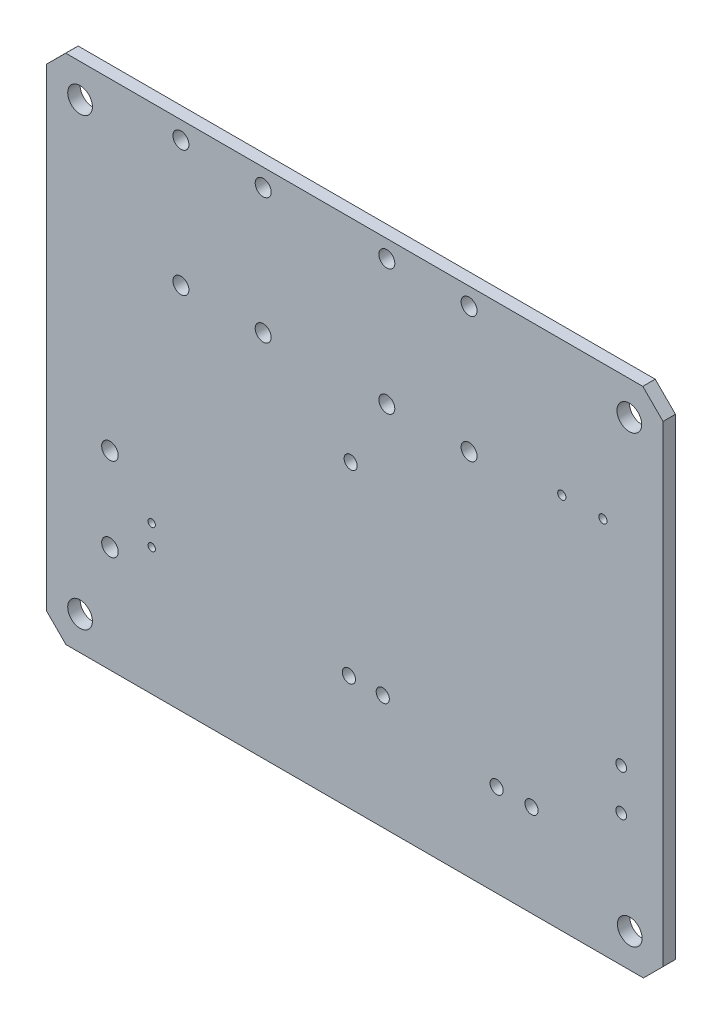
ISO-10303-21;
HEADER;
FILE_DESCRIPTION(('STEP AP214'),'2;1');
FILE_NAME('part.step','',(''),(''),'','','');
FILE_SCHEMA(('AUTOMOTIVE_DESIGN { 1 0 10303 214 1 1 1 1 }'));
ENDSEC;
DATA;
#1=APPLICATION_CONTEXT('core data for automotive mechanical design processes');
#2=APPLICATION_PROTOCOL_DEFINITION('international standard','automotive_design',2000,#1);
#3=PRODUCT_CONTEXT('',#1,'mechanical');
#4=PRODUCT('Part','Part','',(#3));
#5=PRODUCT_RELATED_PRODUCT_CATEGORY('part','',(#4));
#6=PRODUCT_DEFINITION_FORMATION('','',#4);
#7=PRODUCT_DEFINITION_CONTEXT('part definition',#1,'design');
#8=PRODUCT_DEFINITION('design','',#6,#7);
#9=PRODUCT_DEFINITION_SHAPE('','',#8);
#10=(LENGTH_UNIT() NAMED_UNIT(*) SI_UNIT(.MILLI.,.METRE.));
#11=(NAMED_UNIT(*) PLANE_ANGLE_UNIT() SI_UNIT($,.RADIAN.));
#12=(NAMED_UNIT(*) SI_UNIT($,.STERADIAN.) SOLID_ANGLE_UNIT());
#13=UNCERTAINTY_MEASURE_WITH_UNIT(LENGTH_MEASURE(1.E-05),#10,'distance_accuracy_value','');
#14=(GEOMETRIC_REPRESENTATION_CONTEXT(3) GLOBAL_UNCERTAINTY_ASSIGNED_CONTEXT((#13)) GLOBAL_UNIT_ASSIGNED_CONTEXT((#10,
#11,#12)) REPRESENTATION_CONTEXT('',''));
#15=CARTESIAN_POINT('',(0.,0.,0.));
#16=DIRECTION('',(0.,0.,1.));
#17=DIRECTION('',(1.,0.,0.));
#18=AXIS2_PLACEMENT_3D('',#15,#16,#17);
#19=CARTESIAN_POINT('',(178.2064,-82.6516,-0.046));
#20=DIRECTION('',(0.,0.,-1.));
#21=DIRECTION('',(0.,-1.,0.));
#22=AXIS2_PLACEMENT_3D('',#19,#20,#21);
#23=CYLINDRICAL_SURFACE('',#22,1.5);
#24=CARTESIAN_POINT('',(178.2064,-82.6516,1.51));
#25=DIRECTION('',(0.,0.,-1.));
#26=DIRECTION('',(0.,-1.,0.));
#27=AXIS2_PLACEMENT_3D('',#24,#25,#26);
#28=CIRCLE('',#27,1.5);
#29=CARTESIAN_POINT('',(178.2064,-84.1516,1.51));
#30=VERTEX_POINT('',#29);
#31=EDGE_CURVE('E225',#30,#30,#28,.T.);
#32=ORIENTED_EDGE('',*,*,#31,.F.);
#33=EDGE_LOOP('',(#32));
#34=FACE_BOUND('',#33,.T.);
#35=CARTESIAN_POINT('',(178.2064,-82.6516,0.));
#36=DIRECTION('',(0.,0.,-1.));
#37=DIRECTION('',(0.,-1.,0.));
#38=AXIS2_PLACEMENT_3D('',#35,#36,#37);
#39=CIRCLE('',#38,1.5);
#40=CARTESIAN_POINT('',(178.2064,-84.1516,0.));
#41=VERTEX_POINT('',#40);
#42=EDGE_CURVE('E115',#41,#41,#39,.T.);
#43=ORIENTED_EDGE('',*,*,#42,.T.);
#44=EDGE_LOOP('',(#43));
#45=FACE_BOUND('',#44,.T.);
#46=ADVANCED_FACE('F16',(#34,#45),#23,.F.);
#47=CARTESIAN_POINT('',(158.7246,-80.6958,-0.046));
#48=DIRECTION('',(0.,0.,-1.));
#49=DIRECTION('',(0.,-1.,0.));
#50=AXIS2_PLACEMENT_3D('',#47,#48,#49);
#51=CYLINDRICAL_SURFACE('',#50,0.97);
#52=CARTESIAN_POINT('',(158.7246,-80.6958,1.51));
#53=DIRECTION('',(0.,0.,-1.));
#54=DIRECTION('',(0.,-1.,0.));
#55=AXIS2_PLACEMENT_3D('',#52,#53,#54);
#56=CIRCLE('',#55,0.97);
#57=CARTESIAN_POINT('',(158.7246,-81.6658,1.51));
#58=VERTEX_POINT('',#57);
#59=EDGE_CURVE('E221',#58,#58,#56,.T.);
#60=ORIENTED_EDGE('',*,*,#59,.F.);
#61=EDGE_LOOP('',(#60));
#62=FACE_BOUND('',#61,.T.);
#63=CARTESIAN_POINT('',(158.7246,-80.6958,0.));
#64=DIRECTION('',(0.,0.,-1.));
#65=DIRECTION('',(0.,-1.,0.));
#66=AXIS2_PLACEMENT_3D('',#63,#64,#65);
#67=CIRCLE('',#66,0.97);
#68=CARTESIAN_POINT('',(158.7246,-81.6658,0.));
#69=VERTEX_POINT('',#68);
#70=EDGE_CURVE('E187',#69,#69,#67,.T.);
#71=ORIENTED_EDGE('',*,*,#70,.T.);
#72=EDGE_LOOP('',(#71));
#73=FACE_BOUND('',#72,.T.);
#74=ADVANCED_FACE('F18',(#62,#73),#51,.F.);
#75=CARTESIAN_POINT('',(148.7246,-80.6958,-0.046));
#76=DIRECTION('',(0.,0.,-1.));
#77=DIRECTION('',(0.,-1.,0.));
#78=AXIS2_PLACEMENT_3D('',#75,#76,#77);
#79=CYLINDRICAL_SURFACE('',#78,0.97);
#80=CARTESIAN_POINT('',(148.7246,-80.6958,1.51));
#81=DIRECTION('',(0.,0.,-1.));
#82=DIRECTION('',(0.,-1.,0.));
#83=AXIS2_PLACEMENT_3D('',#80,#81,#82);
#84=CIRCLE('',#83,0.97);
#85=CARTESIAN_POINT('',(148.7246,-81.6658,1.51));
#86=VERTEX_POINT('',#85);
#87=EDGE_CURVE('E226',#86,#86,#84,.T.);
#88=ORIENTED_EDGE('',*,*,#87,.F.);
#89=EDGE_LOOP('',(#88));
#90=FACE_BOUND('',#89,.T.);
#91=CARTESIAN_POINT('',(148.7246,-80.6958,0.));
#92=DIRECTION('',(0.,0.,-1.));
#93=DIRECTION('',(0.,-1.,0.));
#94=AXIS2_PLACEMENT_3D('',#91,#92,#93);
#95=CIRCLE('',#94,0.97);
#96=CARTESIAN_POINT('',(148.7246,-81.6658,0.));
#97=VERTEX_POINT('',#96);
#98=EDGE_CURVE('E183',#97,#97,#95,.T.);
#99=ORIENTED_EDGE('',*,*,#98,.T.);
#100=EDGE_LOOP('',(#99));
#101=FACE_BOUND('',#100,.T.);
#102=ADVANCED_FACE('F481',(#90,#101),#79,.F.);
#103=CARTESIAN_POINT('',(174.996723,-94.9452,-0.046));
#104=DIRECTION('',(0.,0.,-1.));
#105=DIRECTION('',(0.,-1.,0.));
#106=AXIS2_PLACEMENT_3D('',#103,#104,#105);
#107=CYLINDRICAL_SURFACE('',#106,0.5);
#108=CARTESIAN_POINT('',(174.996723,-94.9452,1.51));
#109=DIRECTION('',(0.,0.,-1.));
#110=DIRECTION('',(0.,-1.,0.));
#111=AXIS2_PLACEMENT_3D('',#108,#109,#110);
#112=CIRCLE('',#111,0.5);
#113=CARTESIAN_POINT('',(174.996723,-95.4452,1.51));
#114=VERTEX_POINT('',#113);
#115=EDGE_CURVE('E316',#114,#114,#112,.T.);
#116=ORIENTED_EDGE('',*,*,#115,.F.);
#117=EDGE_LOOP('',(#116));
#118=FACE_BOUND('',#117,.T.);
#119=CARTESIAN_POINT('',(174.996723,-94.9452,0.));
#120=DIRECTION('',(0.,0.,-1.));
#121=DIRECTION('',(0.,-1.,0.));
#122=AXIS2_PLACEMENT_3D('',#119,#120,#121);
#123=CIRCLE('',#122,0.5);
#124=CARTESIAN_POINT('',(174.996723,-95.4452,0.));
#125=VERTEX_POINT('',#124);
#126=EDGE_CURVE('E188',#125,#125,#123,.T.);
#127=ORIENTED_EDGE('',*,*,#126,.T.);
#128=EDGE_LOOP('',(#127));
#129=FACE_BOUND('',#128,.T.);
#130=ADVANCED_FACE('F486',(#118,#129),#107,.F.);
#131=CARTESIAN_POINT('',(169.996723,-94.9452,-0.046));
#132=DIRECTION('',(0.,0.,-1.));
#133=DIRECTION('',(0.,-1.,0.));
#134=AXIS2_PLACEMENT_3D('',#131,#132,#133);
#135=CYLINDRICAL_SURFACE('',#134,0.5);
#136=CARTESIAN_POINT('',(169.996723,-94.9452,1.51));
#137=DIRECTION('',(0.,0.,-1.));
#138=DIRECTION('',(0.,-1.,0.));
#139=AXIS2_PLACEMENT_3D('',#136,#137,#138);
#140=CIRCLE('',#139,0.5);
#141=CARTESIAN_POINT('',(169.996723,-95.4452,1.51));
#142=VERTEX_POINT('',#141);
#143=EDGE_CURVE('E290',#142,#142,#140,.T.);
#144=ORIENTED_EDGE('',*,*,#143,.F.);
#145=EDGE_LOOP('',(#144));
#146=FACE_BOUND('',#145,.T.);
#147=CARTESIAN_POINT('',(169.996723,-94.9452,0.));
#148=DIRECTION('',(0.,0.,-1.));
#149=DIRECTION('',(0.,-1.,0.));
#150=AXIS2_PLACEMENT_3D('',#147,#148,#149);
#151=CIRCLE('',#150,0.5);
#152=CARTESIAN_POINT('',(169.996723,-95.4452,0.));
#153=VERTEX_POINT('',#152);
#154=EDGE_CURVE('E295',#153,#153,#151,.T.);
#155=ORIENTED_EDGE('',*,*,#154,.T.);
#156=EDGE_LOOP('',(#155));
#157=FACE_BOUND('',#156,.T.);
#158=ADVANCED_FACE('F638',(#146,#157),#135,.F.);
#159=CARTESIAN_POINT('',(158.7246,-95.9958,-0.046));
#160=DIRECTION('',(0.,0.,-1.));
#161=DIRECTION('',(0.,-1.,0.));
#162=AXIS2_PLACEMENT_3D('',#159,#160,#161);
#163=CYLINDRICAL_SURFACE('',#162,0.97);
#164=CARTESIAN_POINT('',(158.7246,-95.9958,1.51));
#165=DIRECTION('',(0.,0.,-1.));
#166=DIRECTION('',(0.,-1.,0.));
#167=AXIS2_PLACEMENT_3D('',#164,#165,#166);
#168=CIRCLE('',#167,0.97);
#169=CARTESIAN_POINT('',(158.7246,-96.9658,1.51));
#170=VERTEX_POINT('',#169);
#171=EDGE_CURVE('E286',#170,#170,#168,.T.);
#172=ORIENTED_EDGE('',*,*,#171,.F.);
#173=EDGE_LOOP('',(#172));
#174=FACE_BOUND('',#173,.T.);
#175=CARTESIAN_POINT('',(158.7246,-95.9958,0.));
#176=DIRECTION('',(0.,0.,-1.));
#177=DIRECTION('',(0.,-1.,0.));
#178=AXIS2_PLACEMENT_3D('',#175,#176,#177);
#179=CIRCLE('',#178,0.97);
#180=CARTESIAN_POINT('',(158.7246,-96.9658,0.));
#181=VERTEX_POINT('',#180);
#182=EDGE_CURVE('E285',#181,#181,#179,.T.);
#183=ORIENTED_EDGE('',*,*,#182,.T.);
#184=EDGE_LOOP('',(#183));
#185=FACE_BOUND('',#184,.T.);
#186=ADVANCED_FACE('F643',(#174,#185),#163,.F.);
#187=CARTESIAN_POINT('',(148.7246,-95.9958,-0.046));
#188=DIRECTION('',(0.,0.,-1.));
#189=DIRECTION('',(0.,-1.,0.));
#190=AXIS2_PLACEMENT_3D('',#187,#188,#189);
#191=CYLINDRICAL_SURFACE('',#190,0.97);
#192=CARTESIAN_POINT('',(148.7246,-95.9958,1.51));
#193=DIRECTION('',(0.,0.,-1.));
#194=DIRECTION('',(0.,-1.,0.));
#195=AXIS2_PLACEMENT_3D('',#192,#193,#194);
#196=CIRCLE('',#195,0.97);
#197=CARTESIAN_POINT('',(148.7246,-96.9658,1.51));
#198=VERTEX_POINT('',#197);
#199=EDGE_CURVE('E291',#198,#198,#196,.T.);
#200=ORIENTED_EDGE('',*,*,#199,.F.);
#201=EDGE_LOOP('',(#200));
#202=FACE_BOUND('',#201,.T.);
#203=CARTESIAN_POINT('',(148.7246,-95.9958,0.));
#204=DIRECTION('',(0.,0.,-1.));
#205=DIRECTION('',(0.,-1.,0.));
#206=AXIS2_PLACEMENT_3D('',#203,#204,#205);
#207=CIRCLE('',#206,0.97);
#208=CARTESIAN_POINT('',(148.7246,-96.9658,0.));
#209=VERTEX_POINT('',#208);
#210=EDGE_CURVE('E281',#209,#209,#207,.T.);
#211=ORIENTED_EDGE('',*,*,#210,.T.);
#212=EDGE_LOOP('',(#211));
#213=FACE_BOUND('',#212,.T.);
#214=ADVANCED_FACE('F711',(#202,#213),#191,.F.);
#215=CARTESIAN_POINT('',(133.6924,-80.7078,-0.046));
#216=DIRECTION('',(0.,0.,-1.));
#217=DIRECTION('',(0.,-1.,0.));
#218=AXIS2_PLACEMENT_3D('',#215,#216,#217);
#219=CYLINDRICAL_SURFACE('',#218,0.97);
#220=CARTESIAN_POINT('',(133.6924,-80.7078,1.51));
#221=DIRECTION('',(0.,0.,-1.));
#222=DIRECTION('',(0.,-1.,0.));
#223=AXIS2_PLACEMENT_3D('',#220,#221,#222);
#224=CIRCLE('',#223,0.97);
#225=CARTESIAN_POINT('',(133.6924,-81.6778,1.51));
#226=VERTEX_POINT('',#225);
#227=EDGE_CURVE('E361',#226,#226,#224,.T.);
#228=ORIENTED_EDGE('',*,*,#227,.F.);
#229=EDGE_LOOP('',(#228));
#230=FACE_BOUND('',#229,.T.);
#231=CARTESIAN_POINT('',(133.6924,-80.7078,0.));
#232=DIRECTION('',(0.,0.,-1.));
#233=DIRECTION('',(0.,-1.,0.));
#234=AXIS2_PLACEMENT_3D('',#231,#232,#233);
#235=CIRCLE('',#234,0.97);
#236=CARTESIAN_POINT('',(133.6924,-81.6778,0.));
#237=VERTEX_POINT('',#236);
#238=EDGE_CURVE('E277',#237,#237,#235,.T.);
#239=ORIENTED_EDGE('',*,*,#238,.T.);
#240=EDGE_LOOP('',(#239));
#241=FACE_BOUND('',#240,.T.);
#242=ADVANCED_FACE('F673',(#230,#241),#219,.F.);
#243=CARTESIAN_POINT('',(123.6924,-80.7078,-0.046));
#244=DIRECTION('',(0.,0.,-1.));
#245=DIRECTION('',(0.,-1.,0.));
#246=AXIS2_PLACEMENT_3D('',#243,#244,#245);
#247=CYLINDRICAL_SURFACE('',#246,0.97);
#248=CARTESIAN_POINT('',(123.6924,-80.7078,1.51));
#249=DIRECTION('',(0.,0.,-1.));
#250=DIRECTION('',(0.,-1.,0.));
#251=AXIS2_PLACEMENT_3D('',#248,#249,#250);
#252=CIRCLE('',#251,0.97);
#253=CARTESIAN_POINT('',(123.6924,-81.6778,1.51));
#254=VERTEX_POINT('',#253);
#255=EDGE_CURVE('E357',#254,#254,#252,.T.);
#256=ORIENTED_EDGE('',*,*,#255,.F.);
#257=EDGE_LOOP('',(#256));
#258=FACE_BOUND('',#257,.T.);
#259=CARTESIAN_POINT('',(123.6924,-80.7078,0.));
#260=DIRECTION('',(0.,0.,-1.));
#261=DIRECTION('',(0.,-1.,0.));
#262=AXIS2_PLACEMENT_3D('',#259,#260,#261);
#263=CIRCLE('',#262,0.97);
#264=CARTESIAN_POINT('',(123.6924,-81.6778,0.));
#265=VERTEX_POINT('',#264);
#266=EDGE_CURVE('E211',#265,#265,#263,.T.);
#267=ORIENTED_EDGE('',*,*,#266,.T.);
#268=EDGE_LOOP('',(#267));
#269=FACE_BOUND('',#268,.T.);
#270=ADVANCED_FACE('F667',(#258,#269),#247,.F.);
#271=CARTESIAN_POINT('',(111.4298,-82.6008,-0.046));
#272=DIRECTION('',(0.,0.,-1.));
#273=DIRECTION('',(0.,-1.,0.));
#274=AXIS2_PLACEMENT_3D('',#271,#272,#273);
#275=CYLINDRICAL_SURFACE('',#274,1.5);
#276=CARTESIAN_POINT('',(111.4298,-82.6008,1.51));
#277=DIRECTION('',(0.,0.,-1.));
#278=DIRECTION('',(0.,-1.,0.));
#279=AXIS2_PLACEMENT_3D('',#276,#277,#278);
#280=CIRCLE('',#279,1.5);
#281=CARTESIAN_POINT('',(111.4298,-84.1008,1.51));
#282=VERTEX_POINT('',#281);
#283=EDGE_CURVE('E353',#282,#282,#280,.T.);
#284=ORIENTED_EDGE('',*,*,#283,.F.);
#285=EDGE_LOOP('',(#284));
#286=FACE_BOUND('',#285,.T.);
#287=CARTESIAN_POINT('',(111.4298,-82.6008,0.));
#288=DIRECTION('',(0.,0.,-1.));
#289=DIRECTION('',(0.,-1.,0.));
#290=AXIS2_PLACEMENT_3D('',#287,#288,#289);
#291=CIRCLE('',#290,1.5);
#292=CARTESIAN_POINT('',(111.4298,-84.1008,0.));
#293=VERTEX_POINT('',#292);
#294=EDGE_CURVE('E207',#293,#293,#291,.T.);
#295=ORIENTED_EDGE('',*,*,#294,.T.);
#296=EDGE_LOOP('',(#295));
#297=FACE_BOUND('',#296,.T.);
#298=ADVANCED_FACE('F672',(#286,#297),#275,.F.);
#299=CARTESIAN_POINT('',(133.6924,-96.0078,-0.046));
#300=DIRECTION('',(0.,0.,-1.));
#301=DIRECTION('',(0.,-1.,0.));
#302=AXIS2_PLACEMENT_3D('',#299,#300,#301);
#303=CYLINDRICAL_SURFACE('',#302,0.97);
#304=CARTESIAN_POINT('',(133.6924,-96.0078,1.51));
#305=DIRECTION('',(0.,0.,-1.));
#306=DIRECTION('',(0.,-1.,0.));
#307=AXIS2_PLACEMENT_3D('',#304,#305,#306);
#308=CIRCLE('',#307,0.97);
#309=CARTESIAN_POINT('',(133.6924,-96.9778,1.51));
#310=VERTEX_POINT('',#309);
#311=EDGE_CURVE('E349',#310,#310,#308,.T.);
#312=ORIENTED_EDGE('',*,*,#311,.F.);
#313=EDGE_LOOP('',(#312));
#314=FACE_BOUND('',#313,.T.);
#315=CARTESIAN_POINT('',(133.6924,-96.0078,0.));
#316=DIRECTION('',(0.,0.,-1.));
#317=DIRECTION('',(0.,-1.,0.));
#318=AXIS2_PLACEMENT_3D('',#315,#316,#317);
#319=CIRCLE('',#318,0.97);
#320=CARTESIAN_POINT('',(133.6924,-96.9778,0.));
#321=VERTEX_POINT('',#320);
#322=EDGE_CURVE('E212',#321,#321,#319,.T.);
#323=ORIENTED_EDGE('',*,*,#322,.T.);
#324=EDGE_LOOP('',(#323));
#325=FACE_BOUND('',#324,.T.);
#326=ADVANCED_FACE('F683',(#314,#325),#303,.F.);
#327=CARTESIAN_POINT('',(144.329802,-104.300798,-0.046));
#328=DIRECTION('',(0.,0.,-1.));
#329=DIRECTION('',(0.,-1.,0.));
#330=AXIS2_PLACEMENT_3D('',#327,#328,#329);
#331=CYLINDRICAL_SURFACE('',#330,0.8);
#332=CARTESIAN_POINT('',(144.329802,-104.300798,1.51));
#333=DIRECTION('',(0.,0.,-1.));
#334=DIRECTION('',(0.,-1.,0.));
#335=AXIS2_PLACEMENT_3D('',#332,#333,#334);
#336=CIRCLE('',#335,0.8);
#337=CARTESIAN_POINT('',(144.329802,-105.100798,1.51));
#338=VERTEX_POINT('',#337);
#339=EDGE_CURVE('E345',#338,#338,#336,.T.);
#340=ORIENTED_EDGE('',*,*,#339,.F.);
#341=EDGE_LOOP('',(#340));
#342=FACE_BOUND('',#341,.T.);
#343=CARTESIAN_POINT('',(144.329802,-104.300798,0.));
#344=DIRECTION('',(0.,0.,-1.));
#345=DIRECTION('',(0.,-1.,0.));
#346=AXIS2_PLACEMENT_3D('',#343,#344,#345);
#347=CIRCLE('',#346,0.8);
#348=CARTESIAN_POINT('',(144.329802,-105.100798,0.));
#349=VERTEX_POINT('',#348);
#350=EDGE_CURVE('E176',#349,#349,#347,.T.);
#351=ORIENTED_EDGE('',*,*,#350,.T.);
#352=EDGE_LOOP('',(#351));
#353=FACE_BOUND('',#352,.T.);
#354=ADVANCED_FACE('F661',(#342,#353),#331,.F.);
#355=CARTESIAN_POINT('',(123.6924,-96.0078,-0.046));
#356=DIRECTION('',(0.,0.,-1.));
#357=DIRECTION('',(0.,-1.,0.));
#358=AXIS2_PLACEMENT_3D('',#355,#356,#357);
#359=CYLINDRICAL_SURFACE('',#358,0.97);
#360=CARTESIAN_POINT('',(123.6924,-96.0078,1.51));
#361=DIRECTION('',(0.,0.,-1.));
#362=DIRECTION('',(0.,-1.,0.));
#363=AXIS2_PLACEMENT_3D('',#360,#361,#362);
#364=CIRCLE('',#363,0.97);
#365=CARTESIAN_POINT('',(123.6924,-96.9778,1.51));
#366=VERTEX_POINT('',#365);
#367=EDGE_CURVE('E341',#366,#366,#364,.T.);
#368=ORIENTED_EDGE('',*,*,#367,.F.);
#369=EDGE_LOOP('',(#368));
#370=FACE_BOUND('',#369,.T.);
#371=CARTESIAN_POINT('',(123.6924,-96.0078,0.));
#372=DIRECTION('',(0.,0.,-1.));
#373=DIRECTION('',(0.,-1.,0.));
#374=AXIS2_PLACEMENT_3D('',#371,#372,#373);
#375=CIRCLE('',#374,0.97);
#376=CARTESIAN_POINT('',(123.6924,-96.9778,0.));
#377=VERTEX_POINT('',#376);
#378=EDGE_CURVE('E172',#377,#377,#375,.T.);
#379=ORIENTED_EDGE('',*,*,#378,.T.);
#380=EDGE_LOOP('',(#379));
#381=FACE_BOUND('',#380,.T.);
#382=ADVANCED_FACE('F652',(#370,#381),#359,.F.);
#383=CARTESIAN_POINT('',(177.2158,-119.800798,-0.046));
#384=DIRECTION('',(0.,0.,-1.));
#385=DIRECTION('',(0.,-1.,0.));
#386=AXIS2_PLACEMENT_3D('',#383,#384,#385);
#387=CYLINDRICAL_SURFACE('',#386,0.65);
#388=CARTESIAN_POINT('',(177.2158,-119.800798,1.51));
#389=DIRECTION('',(0.,0.,-1.));
#390=DIRECTION('',(0.,-1.,0.));
#391=AXIS2_PLACEMENT_3D('',#388,#389,#390);
#392=CIRCLE('',#391,0.65);
#393=CARTESIAN_POINT('',(177.2158,-120.450798,1.51));
#394=VERTEX_POINT('',#393);
#395=EDGE_CURVE('E337',#394,#394,#392,.T.);
#396=ORIENTED_EDGE('',*,*,#395,.F.);
#397=EDGE_LOOP('',(#396));
#398=FACE_BOUND('',#397,.T.);
#399=CARTESIAN_POINT('',(177.2158,-119.800798,0.));
#400=DIRECTION('',(0.,0.,-1.));
#401=DIRECTION('',(0.,-1.,0.));
#402=AXIS2_PLACEMENT_3D('',#399,#400,#401);
#403=CIRCLE('',#402,0.65);
#404=CARTESIAN_POINT('',(177.2158,-120.450798,0.));
#405=VERTEX_POINT('',#404);
#406=EDGE_CURVE('E177',#405,#405,#403,.T.);
#407=ORIENTED_EDGE('',*,*,#406,.T.);
#408=EDGE_LOOP('',(#407));
#409=FACE_BOUND('',#408,.T.);
#410=ADVANCED_FACE('F593',(#398,#409),#387,.F.);
#411=CARTESIAN_POINT('',(177.2158,-124.800798,-0.046));
#412=DIRECTION('',(0.,0.,-1.));
#413=DIRECTION('',(0.,-1.,0.));
#414=AXIS2_PLACEMENT_3D('',#411,#412,#413);
#415=CYLINDRICAL_SURFACE('',#414,0.65);
#416=CARTESIAN_POINT('',(177.2158,-124.800798,1.51));
#417=DIRECTION('',(0.,0.,-1.));
#418=DIRECTION('',(0.,-1.,0.));
#419=AXIS2_PLACEMENT_3D('',#416,#417,#418);
#420=CIRCLE('',#419,0.65);
#421=CARTESIAN_POINT('',(177.2158,-125.450798,1.51));
#422=VERTEX_POINT('',#421);
#423=EDGE_CURVE('E142',#422,#422,#420,.T.);
#424=ORIENTED_EDGE('',*,*,#423,.F.);
#425=EDGE_LOOP('',(#424));
#426=FACE_BOUND('',#425,.T.);
#427=CARTESIAN_POINT('',(177.2158,-124.800798,0.));
#428=DIRECTION('',(0.,0.,-1.));
#429=DIRECTION('',(0.,-1.,0.));
#430=AXIS2_PLACEMENT_3D('',#427,#428,#429);
#431=CIRCLE('',#430,0.65);
#432=CARTESIAN_POINT('',(177.2158,-125.450798,0.));
#433=VERTEX_POINT('',#432);
#434=EDGE_CURVE('E250',#433,#433,#431,.T.);
#435=ORIENTED_EDGE('',*,*,#434,.T.);
#436=EDGE_LOOP('',(#435));
#437=FACE_BOUND('',#436,.T.);
#438=ADVANCED_FACE('F588',(#426,#437),#415,.F.);
#439=CARTESIAN_POINT('',(166.319202,-129.616198,-0.046));
#440=DIRECTION('',(0.,0.,-1.));
#441=DIRECTION('',(0.,-1.,0.));
#442=AXIS2_PLACEMENT_3D('',#439,#440,#441);
#443=CYLINDRICAL_SURFACE('',#442,0.8);
#444=CARTESIAN_POINT('',(166.319202,-129.616198,1.51));
#445=DIRECTION('',(0.,0.,-1.));
#446=DIRECTION('',(0.,-1.,0.));
#447=AXIS2_PLACEMENT_3D('',#444,#445,#446);
#448=CIRCLE('',#447,0.8);
#449=CARTESIAN_POINT('',(166.319202,-130.416198,1.51));
#450=VERTEX_POINT('',#449);
#451=EDGE_CURVE('E333',#450,#450,#448,.T.);
#452=ORIENTED_EDGE('',*,*,#451,.F.);
#453=EDGE_LOOP('',(#452));
#454=FACE_BOUND('',#453,.T.);
#455=CARTESIAN_POINT('',(166.319202,-129.616198,0.));
#456=DIRECTION('',(0.,0.,-1.));
#457=DIRECTION('',(0.,-1.,0.));
#458=AXIS2_PLACEMENT_3D('',#455,#456,#457);
#459=CIRCLE('',#458,0.8);
#460=CARTESIAN_POINT('',(166.319202,-130.416198,0.));
#461=VERTEX_POINT('',#460);
#462=EDGE_CURVE('E246',#461,#461,#459,.T.);
#463=ORIENTED_EDGE('',*,*,#462,.T.);
#464=EDGE_LOOP('',(#463));
#465=FACE_BOUND('',#464,.T.);
#466=ADVANCED_FACE('F566',(#454,#465),#443,.F.);
#467=CARTESIAN_POINT('',(178.2572,-136.7282,-0.046));
#468=DIRECTION('',(0.,0.,-1.));
#469=DIRECTION('',(0.,-1.,0.));
#470=AXIS2_PLACEMENT_3D('',#467,#468,#469);
#471=CYLINDRICAL_SURFACE('',#470,1.5);
#472=CARTESIAN_POINT('',(178.2572,-136.7282,1.51));
#473=DIRECTION('',(0.,0.,-1.));
#474=DIRECTION('',(0.,-1.,0.));
#475=AXIS2_PLACEMENT_3D('',#472,#473,#474);
#476=CIRCLE('',#475,1.5);
#477=CARTESIAN_POINT('',(178.2572,-138.2282,1.51));
#478=VERTEX_POINT('',#477);
#479=EDGE_CURVE('E272',#478,#478,#476,.T.);
#480=ORIENTED_EDGE('',*,*,#479,.F.);
#481=EDGE_LOOP('',(#480));
#482=FACE_BOUND('',#481,.T.);
#483=CARTESIAN_POINT('',(178.2572,-136.7282,0.));
#484=DIRECTION('',(0.,0.,-1.));
#485=DIRECTION('',(0.,-1.,0.));
#486=AXIS2_PLACEMENT_3D('',#483,#484,#485);
#487=CIRCLE('',#486,1.5);
#488=CARTESIAN_POINT('',(178.2572,-138.2282,0.));
#489=VERTEX_POINT('',#488);
#490=EDGE_CURVE('E238',#489,#489,#487,.T.);
#491=ORIENTED_EDGE('',*,*,#490,.T.);
#492=EDGE_LOOP('',(#491));
#493=FACE_BOUND('',#492,.T.);
#494=ADVANCED_FACE('F560',(#482,#493),#471,.F.);
#495=CARTESIAN_POINT('',(162.077402,-129.616198,-0.046));
#496=DIRECTION('',(0.,0.,-1.));
#497=DIRECTION('',(0.,-1.,0.));
#498=AXIS2_PLACEMENT_3D('',#495,#496,#497);
#499=CYLINDRICAL_SURFACE('',#498,0.8);
#500=CARTESIAN_POINT('',(162.077402,-129.616198,1.51));
#501=DIRECTION('',(0.,0.,-1.));
#502=DIRECTION('',(0.,-1.,0.));
#503=AXIS2_PLACEMENT_3D('',#500,#501,#502);
#504=CIRCLE('',#503,0.8);
#505=CARTESIAN_POINT('',(162.077402,-130.416198,1.51));
#506=VERTEX_POINT('',#505);
#507=EDGE_CURVE('E268',#506,#506,#504,.T.);
#508=ORIENTED_EDGE('',*,*,#507,.F.);
#509=EDGE_LOOP('',(#508));
#510=FACE_BOUND('',#509,.T.);
#511=CARTESIAN_POINT('',(162.077402,-129.616198,0.));
#512=DIRECTION('',(0.,0.,-1.));
#513=DIRECTION('',(0.,-1.,0.));
#514=AXIS2_PLACEMENT_3D('',#511,#512,#513);
#515=CIRCLE('',#514,0.8);
#516=CARTESIAN_POINT('',(162.077402,-130.416198,0.));
#517=VERTEX_POINT('',#516);
#518=EDGE_CURVE('E234',#517,#517,#515,.T.);
#519=ORIENTED_EDGE('',*,*,#518,.T.);
#520=EDGE_LOOP('',(#519));
#521=FACE_BOUND('',#520,.T.);
#522=ADVANCED_FACE('F565',(#510,#521),#499,.F.);
#523=CARTESIAN_POINT('',(148.229802,-126.900798,-0.046));
#524=DIRECTION('',(0.,0.,-1.));
#525=DIRECTION('',(0.,-1.,0.));
#526=AXIS2_PLACEMENT_3D('',#523,#524,#525);
#527=CYLINDRICAL_SURFACE('',#526,0.8);
#528=CARTESIAN_POINT('',(148.229802,-126.900798,1.51));
#529=DIRECTION('',(0.,0.,-1.));
#530=DIRECTION('',(0.,-1.,0.));
#531=AXIS2_PLACEMENT_3D('',#528,#529,#530);
#532=CIRCLE('',#531,0.8);
#533=CARTESIAN_POINT('',(148.229802,-127.700798,1.51));
#534=VERTEX_POINT('',#533);
#535=EDGE_CURVE('E273',#534,#534,#532,.T.);
#536=ORIENTED_EDGE('',*,*,#535,.F.);
#537=EDGE_LOOP('',(#536));
#538=FACE_BOUND('',#537,.T.);
#539=CARTESIAN_POINT('',(148.229802,-126.900798,0.));
#540=DIRECTION('',(0.,0.,-1.));
#541=DIRECTION('',(0.,-1.,0.));
#542=AXIS2_PLACEMENT_3D('',#539,#540,#541);
#543=CIRCLE('',#542,0.8);
#544=CARTESIAN_POINT('',(148.229802,-127.700798,0.));
#545=VERTEX_POINT('',#544);
#546=EDGE_CURVE('E230',#545,#545,#543,.T.);
#547=ORIENTED_EDGE('',*,*,#546,.T.);
#548=EDGE_LOOP('',(#547));
#549=FACE_BOUND('',#548,.T.);
#550=ADVANCED_FACE('F611',(#538,#549),#527,.F.);
#551=CARTESIAN_POINT('',(120.142,-122.809,-0.046));
#552=DIRECTION('',(0.,0.,-1.));
#553=DIRECTION('',(0.,-1.,0.));
#554=AXIS2_PLACEMENT_3D('',#551,#552,#553);
#555=CYLINDRICAL_SURFACE('',#554,0.445);
#556=CARTESIAN_POINT('',(120.142,-122.809,1.51));
#557=DIRECTION('',(0.,0.,-1.));
#558=DIRECTION('',(0.,-1.,0.));
#559=AXIS2_PLACEMENT_3D('',#556,#557,#558);
#560=CIRCLE('',#559,0.445);
#561=CARTESIAN_POINT('',(120.142,-123.254,1.51));
#562=VERTEX_POINT('',#561);
#563=EDGE_CURVE('E323',#562,#562,#560,.T.);
#564=ORIENTED_EDGE('',*,*,#563,.F.);
#565=EDGE_LOOP('',(#564));
#566=FACE_BOUND('',#565,.T.);
#567=CARTESIAN_POINT('',(120.142,-122.809,0.));
#568=DIRECTION('',(0.,0.,-1.));
#569=DIRECTION('',(0.,-1.,0.));
#570=AXIS2_PLACEMENT_3D('',#567,#568,#569);
#571=CIRCLE('',#570,0.445);
#572=CARTESIAN_POINT('',(120.142,-123.254,0.));
#573=VERTEX_POINT('',#572);
#574=EDGE_CURVE('E220',#573,#573,#571,.T.);
#575=ORIENTED_EDGE('',*,*,#574,.T.);
#576=EDGE_LOOP('',(#575));
#577=FACE_BOUND('',#576,.T.);
#578=ADVANCED_FACE('F602',(#566,#577),#555,.F.);
#579=CARTESIAN_POINT('',(115.062,-117.729,-0.046));
#580=DIRECTION('',(0.,0.,-1.));
#581=DIRECTION('',(0.,-1.,0.));
#582=AXIS2_PLACEMENT_3D('',#579,#580,#581);
#583=CYLINDRICAL_SURFACE('',#582,1.005);
#584=CARTESIAN_POINT('',(115.062,-117.729,1.51));
#585=DIRECTION('',(0.,0.,-1.));
#586=DIRECTION('',(0.,-1.,0.));
#587=AXIS2_PLACEMENT_3D('',#584,#585,#586);
#588=CIRCLE('',#587,1.005);
#589=CARTESIAN_POINT('',(115.062,-118.734,1.51));
#590=VERTEX_POINT('',#589);
#591=EDGE_CURVE('E242',#590,#590,#588,.T.);
#592=ORIENTED_EDGE('',*,*,#591,.F.);
#593=EDGE_LOOP('',(#592));
#594=FACE_BOUND('',#593,.T.);
#595=CARTESIAN_POINT('',(115.062,-117.729,0.));
#596=DIRECTION('',(0.,0.,-1.));
#597=DIRECTION('',(0.,-1.,0.));
#598=AXIS2_PLACEMENT_3D('',#595,#596,#597);
#599=CIRCLE('',#598,1.005);
#600=CARTESIAN_POINT('',(115.062,-118.734,0.));
#601=VERTEX_POINT('',#600);
#602=EDGE_CURVE('E216',#601,#601,#599,.T.);
#603=ORIENTED_EDGE('',*,*,#602,.T.);
#604=EDGE_LOOP('',(#603));
#605=FACE_BOUND('',#604,.T.);
#606=ADVANCED_FACE('F582',(#594,#605),#583,.F.);
#607=CARTESIAN_POINT('',(144.115002,-126.900798,-0.046));
#608=DIRECTION('',(0.,0.,-1.));
#609=DIRECTION('',(0.,-1.,0.));
#610=AXIS2_PLACEMENT_3D('',#607,#608,#609);
#611=CYLINDRICAL_SURFACE('',#610,0.8);
#612=CARTESIAN_POINT('',(144.115002,-126.900798,1.51));
#613=DIRECTION('',(0.,0.,-1.));
#614=DIRECTION('',(0.,-1.,0.));
#615=AXIS2_PLACEMENT_3D('',#612,#613,#614);
#616=CIRCLE('',#615,0.8);
#617=CARTESIAN_POINT('',(144.115002,-127.700798,1.51));
#618=VERTEX_POINT('',#617);
#619=EDGE_CURVE('E167',#618,#618,#616,.T.);
#620=ORIENTED_EDGE('',*,*,#619,.F.);
#621=EDGE_LOOP('',(#620));
#622=FACE_BOUND('',#621,.T.);
#623=CARTESIAN_POINT('',(144.115002,-126.900798,0.));
#624=DIRECTION('',(0.,0.,-1.));
#625=DIRECTION('',(0.,-1.,0.));
#626=AXIS2_PLACEMENT_3D('',#623,#624,#625);
#627=CIRCLE('',#626,0.8);
#628=CARTESIAN_POINT('',(144.115002,-127.700798,0.));
#629=VERTEX_POINT('',#628);
#630=EDGE_CURVE('E206',#629,#629,#627,.T.);
#631=ORIENTED_EDGE('',*,*,#630,.T.);
#632=EDGE_LOOP('',(#631));
#633=FACE_BOUND('',#632,.T.);
#634=ADVANCED_FACE('F474',(#622,#633),#611,.F.);
#635=CARTESIAN_POINT('',(120.142,-125.349,-0.046));
#636=DIRECTION('',(0.,0.,-1.));
#637=DIRECTION('',(0.,-1.,0.));
#638=AXIS2_PLACEMENT_3D('',#635,#636,#637);
#639=CYLINDRICAL_SURFACE('',#638,0.445);
#640=CARTESIAN_POINT('',(120.142,-125.349,1.51));
#641=DIRECTION('',(0.,0.,-1.));
#642=DIRECTION('',(0.,-1.,0.));
#643=AXIS2_PLACEMENT_3D('',#640,#641,#642);
#644=CIRCLE('',#643,0.445);
#645=CARTESIAN_POINT('',(120.142,-125.794,1.51));
#646=VERTEX_POINT('',#645);
#647=EDGE_CURVE('E163',#646,#646,#644,.T.);
#648=ORIENTED_EDGE('',*,*,#647,.F.);
#649=EDGE_LOOP('',(#648));
#650=FACE_BOUND('',#649,.T.);
#651=CARTESIAN_POINT('',(120.142,-125.349,0.));
#652=DIRECTION('',(0.,0.,-1.));
#653=DIRECTION('',(0.,-1.,0.));
#654=AXIS2_PLACEMENT_3D('',#651,#652,#653);
#655=CIRCLE('',#654,0.445);
#656=CARTESIAN_POINT('',(120.142,-125.794,0.));
#657=VERTEX_POINT('',#656);
#658=EDGE_CURVE('E202',#657,#657,#655,.T.);
#659=ORIENTED_EDGE('',*,*,#658,.T.);
#660=EDGE_LOOP('',(#659));
#661=FACE_BOUND('',#660,.T.);
#662=ADVANCED_FACE('F468',(#650,#661),#639,.F.);
#663=CARTESIAN_POINT('',(115.062,-127.889,-0.046));
#664=DIRECTION('',(0.,0.,-1.));
#665=DIRECTION('',(0.,-1.,0.));
#666=AXIS2_PLACEMENT_3D('',#663,#664,#665);
#667=CYLINDRICAL_SURFACE('',#666,1.005);
#668=CARTESIAN_POINT('',(115.062,-127.889,1.51));
#669=DIRECTION('',(0.,0.,-1.));
#670=DIRECTION('',(0.,-1.,0.));
#671=AXIS2_PLACEMENT_3D('',#668,#669,#670);
#672=CIRCLE('',#671,1.005);
#673=CARTESIAN_POINT('',(115.062,-128.894,1.51));
#674=VERTEX_POINT('',#673);
#675=EDGE_CURVE('E168',#674,#674,#672,.T.);
#676=ORIENTED_EDGE('',*,*,#675,.F.);
#677=EDGE_LOOP('',(#676));
#678=FACE_BOUND('',#677,.T.);
#679=CARTESIAN_POINT('',(115.062,-127.889,0.));
#680=DIRECTION('',(0.,0.,-1.));
#681=DIRECTION('',(0.,-1.,0.));
#682=AXIS2_PLACEMENT_3D('',#679,#680,#681);
#683=CIRCLE('',#682,1.005);
#684=CARTESIAN_POINT('',(115.062,-128.894,0.));
#685=VERTEX_POINT('',#684);
#686=EDGE_CURVE('E158',#685,#685,#683,.T.);
#687=ORIENTED_EDGE('',*,*,#686,.T.);
#688=EDGE_LOOP('',(#687));
#689=FACE_BOUND('',#688,.T.);
#690=ADVANCED_FACE('F473',(#678,#689),#667,.F.);
#691=CARTESIAN_POINT('',(111.4298,-136.7536,-0.046));
#692=DIRECTION('',(0.,0.,-1.));
#693=DIRECTION('',(0.,-1.,0.));
#694=AXIS2_PLACEMENT_3D('',#691,#692,#693);
#695=CYLINDRICAL_SURFACE('',#694,1.5);
#696=CARTESIAN_POINT('',(111.4298,-136.7536,1.51));
#697=DIRECTION('',(0.,0.,-1.));
#698=DIRECTION('',(0.,-1.,0.));
#699=AXIS2_PLACEMENT_3D('',#696,#697,#698);
#700=CIRCLE('',#699,1.5);
#701=CARTESIAN_POINT('',(111.4298,-138.2536,1.51));
#702=VERTEX_POINT('',#701);
#703=EDGE_CURVE('E254',#702,#702,#700,.T.);
#704=ORIENTED_EDGE('',*,*,#703,.F.);
#705=EDGE_LOOP('',(#704));
#706=FACE_BOUND('',#705,.T.);
#707=CARTESIAN_POINT('',(111.4298,-136.7536,0.));
#708=DIRECTION('',(0.,0.,-1.));
#709=DIRECTION('',(0.,-1.,0.));
#710=AXIS2_PLACEMENT_3D('',#707,#708,#709);
#711=CIRCLE('',#710,1.5);
#712=CARTESIAN_POINT('',(111.4298,-138.2536,0.));
#713=VERTEX_POINT('',#712);
#714=EDGE_CURVE('E155',#713,#713,#711,.T.);
#715=ORIENTED_EDGE('',*,*,#714,.T.);
#716=EDGE_LOOP('',(#715));
#717=FACE_BOUND('',#716,.T.);
#718=ADVANCED_FACE('F522',(#706,#717),#695,.F.);
#719=CARTESIAN_POINT('',(107.3531,-138.4554,0.));
#720=DIRECTION('',(-1.,0.,0.));
#721=DIRECTION('',(0.,0.,1.));
#722=AXIS2_PLACEMENT_3D('',#719,#720,#721);
#723=PLANE('',#722);
#724=DIRECTION('',(0.,0.,1.));
#725=VECTOR('',#724,1.);
#726=CARTESIAN_POINT('',(107.3531,-138.4554,0.));
#727=LINE('',#726,#725);
#728=CARTESIAN_POINT('',(107.3531,-138.4554,0.));
#729=VERTEX_POINT('',#728);
#730=CARTESIAN_POINT('',(107.3531,-138.4554,1.51));
#731=VERTEX_POINT('',#730);
#732=EDGE_CURVE('E10',#729,#731,#727,.T.);
#733=ORIENTED_EDGE('',*,*,#732,.T.);
#734=DIRECTION('',(0.,1.,0.));
#735=VECTOR('',#734,1.);
#736=CARTESIAN_POINT('',(107.3531,-138.4554,1.51));
#737=LINE('',#736,#735);
#738=CARTESIAN_POINT('',(107.3531,-80.885923,1.51));
#739=VERTEX_POINT('',#738);
#740=EDGE_CURVE('E307',#731,#739,#737,.T.);
#741=ORIENTED_EDGE('',*,*,#740,.T.);
#742=DIRECTION('',(0.,0.,1.));
#743=VECTOR('',#742,1.);
#744=CARTESIAN_POINT('',(107.3531,-80.885923,0.));
#745=LINE('',#744,#743);
#746=CARTESIAN_POINT('',(107.3531,-80.885923,0.));
#747=VERTEX_POINT('',#746);
#748=EDGE_CURVE('E25',#747,#739,#745,.T.);
#749=ORIENTED_EDGE('',*,*,#748,.F.);
#750=DIRECTION('',(0.,1.,0.));
#751=VECTOR('',#750,1.);
#752=CARTESIAN_POINT('',(107.3531,-138.4554,0.));
#753=LINE('',#752,#751);
#754=EDGE_CURVE('E144',#729,#747,#753,.T.);
#755=ORIENTED_EDGE('',*,*,#754,.F.);
#756=EDGE_LOOP('',(#733,#741,#749,#755));
#757=FACE_BOUND('',#756,.T.);
#758=ADVANCED_FACE('F516',(#757),#723,.T.);
#759=CARTESIAN_POINT('',(109.7153,-140.8176,0.));
#760=DIRECTION('',(-0.707106781186548,-0.707106781186548,0.));
#761=DIRECTION('',(-0.707106781186548,0.707106781186548,0.));
#762=AXIS2_PLACEMENT_3D('',#759,#760,#761);
#763=PLANE('',#762);
#764=DIRECTION('',(0.,0.,1.));
#765=VECTOR('',#764,1.);
#766=CARTESIAN_POINT('',(109.7153,-140.8176,0.));
#767=LINE('',#766,#765);
#768=CARTESIAN_POINT('',(109.7153,-140.8176,0.));
#769=VERTEX_POINT('',#768);
#770=CARTESIAN_POINT('',(109.7153,-140.8176,1.51));
#771=VERTEX_POINT('',#770);
#772=EDGE_CURVE('E37',#769,#771,#767,.T.);
#773=ORIENTED_EDGE('',*,*,#772,.T.);
#774=DIRECTION('',(-0.707106781186548,0.707106781186548,0.));
#775=VECTOR('',#774,1.);
#776=CARTESIAN_POINT('',(109.7153,-140.8176,1.51));
#777=LINE('',#776,#775);
#778=EDGE_CURVE('E310',#771,#731,#777,.T.);
#779=ORIENTED_EDGE('',*,*,#778,.T.);
#780=ORIENTED_EDGE('',*,*,#732,.F.);
#781=DIRECTION('',(-0.707106781186548,0.707106781186548,0.));
#782=VECTOR('',#781,1.);
#783=CARTESIAN_POINT('',(109.7153,-140.8176,0.));
#784=LINE('',#783,#782);
#785=EDGE_CURVE('E149',#769,#729,#784,.T.);
#786=ORIENTED_EDGE('',*,*,#785,.F.);
#787=EDGE_LOOP('',(#773,#779,#780,#786));
#788=FACE_BOUND('',#787,.T.);
#789=ADVANCED_FACE('F521',(#788),#763,.T.);
#790=CARTESIAN_POINT('',(107.3531,-80.885923,0.));
#791=DIRECTION('',(-0.705350125345982,0.708859083791982,0.));
#792=DIRECTION('',(0.,0.,1.));
#793=AXIS2_PLACEMENT_3D('',#790,#791,#792);
#794=PLANE('',#793);
#795=ORIENTED_EDGE('',*,*,#748,.T.);
#796=DIRECTION('',(0.708859083791982,0.705350125345982,0.));
#797=VECTOR('',#796,1.);
#798=CARTESIAN_POINT('',(107.3531,-80.885923,1.51));
#799=LINE('',#798,#797);
#800=CARTESIAN_POINT('',(109.688383,-78.5622,1.51));
#801=VERTEX_POINT('',#800);
#802=EDGE_CURVE('E114',#739,#801,#799,.T.);
#803=ORIENTED_EDGE('',*,*,#802,.T.);
#804=DIRECTION('',(0.,0.,1.));
#805=VECTOR('',#804,1.);
#806=CARTESIAN_POINT('',(109.688383,-78.5622,0.));
#807=LINE('',#806,#805);
#808=CARTESIAN_POINT('',(109.688383,-78.5622,0.));
#809=VERTEX_POINT('',#808);
#810=EDGE_CURVE('E109',#809,#801,#807,.T.);
#811=ORIENTED_EDGE('',*,*,#810,.F.);
#812=DIRECTION('',(0.708859083791982,0.705350125345982,0.));
#813=VECTOR('',#812,1.);
#814=CARTESIAN_POINT('',(107.3531,-80.885923,0.));
#815=LINE('',#814,#813);
#816=EDGE_CURVE('E148',#747,#809,#815,.T.);
#817=ORIENTED_EDGE('',*,*,#816,.F.);
#818=EDGE_LOOP('',(#795,#803,#811,#817));
#819=FACE_BOUND('',#818,.T.);
#820=ADVANCED_FACE('F510',(#819),#794,.T.);
#821=CARTESIAN_POINT('',(179.9209,-140.8176,0.));
#822=DIRECTION('',(0.,-1.,0.));
#823=DIRECTION('',(0.,0.,-1.));
#824=AXIS2_PLACEMENT_3D('',#821,#822,#823);
#825=PLANE('',#824);
#826=DIRECTION('',(0.,0.,1.));
#827=VECTOR('',#826,1.);
#828=CARTESIAN_POINT('',(179.9209,-140.8176,0.));
#829=LINE('',#828,#827);
#830=CARTESIAN_POINT('',(179.9209,-140.8176,0.));
#831=VERTEX_POINT('',#830);
#832=CARTESIAN_POINT('',(179.9209,-140.8176,1.51));
#833=VERTEX_POINT('',#832);
#834=EDGE_CURVE('E178',#831,#833,#829,.T.);
#835=ORIENTED_EDGE('',*,*,#834,.T.);
#836=DIRECTION('',(-1.,0.,0.));
#837=VECTOR('',#836,1.);
#838=CARTESIAN_POINT('',(179.9209,-140.8176,1.51));
#839=LINE('',#838,#837);
#840=EDGE_CURVE('E258',#833,#771,#839,.T.);
#841=ORIENTED_EDGE('',*,*,#840,.T.);
#842=ORIENTED_EDGE('',*,*,#772,.F.);
#843=DIRECTION('',(-1.,0.,0.));
#844=VECTOR('',#843,1.);
#845=CARTESIAN_POINT('',(179.9209,-140.8176,0.));
#846=LINE('',#845,#844);
#847=EDGE_CURVE('E195',#831,#769,#846,.T.);
#848=ORIENTED_EDGE('',*,*,#847,.F.);
#849=EDGE_LOOP('',(#835,#841,#842,#848));
#850=FACE_BOUND('',#849,.T.);
#851=ADVANCED_FACE('F462',(#850),#825,.T.);
#852=CARTESIAN_POINT('',(109.688383,-78.5622,0.));
#853=DIRECTION('',(0.,1.,0.));
#854=DIRECTION('',(1.,0.,0.));
#855=AXIS2_PLACEMENT_3D('',#852,#853,#854);
#856=PLANE('',#855);
#857=ORIENTED_EDGE('',*,*,#810,.T.);
#858=DIRECTION('',(1.,0.,0.));
#859=VECTOR('',#858,1.);
#860=CARTESIAN_POINT('',(109.688383,-78.5622,1.51));
#861=LINE('',#860,#859);
#862=CARTESIAN_POINT('',(179.8447,-78.5622,1.51));
#863=VERTEX_POINT('',#862);
#864=EDGE_CURVE('E103',#801,#863,#861,.T.);
#865=ORIENTED_EDGE('',*,*,#864,.T.);
#866=DIRECTION('',(0.,0.,1.));
#867=VECTOR('',#866,1.);
#868=CARTESIAN_POINT('',(179.8447,-78.5622,0.));
#869=LINE('',#868,#867);
#870=CARTESIAN_POINT('',(179.8447,-78.5622,0.));
#871=VERTEX_POINT('',#870);
#872=EDGE_CURVE('E108',#871,#863,#869,.T.);
#873=ORIENTED_EDGE('',*,*,#872,.F.);
#874=DIRECTION('',(1.,0.,0.));
#875=VECTOR('',#874,1.);
#876=CARTESIAN_POINT('',(109.688383,-78.5622,0.));
#877=LINE('',#876,#875);
#878=EDGE_CURVE('E159',#809,#871,#877,.T.);
#879=ORIENTED_EDGE('',*,*,#878,.F.);
#880=EDGE_LOOP('',(#857,#865,#873,#879));
#881=FACE_BOUND('',#880,.T.);
#882=ADVANCED_FACE('F105',(#881),#856,.T.);
#883=CARTESIAN_POINT('',(0.,0.,1.51));
#884=DIRECTION('',(0.,0.,1.));
#885=DIRECTION('',(1.,0.,0.));
#886=AXIS2_PLACEMENT_3D('',#883,#884,#885);
#887=PLANE('',#886);
#888=ORIENTED_EDGE('',*,*,#31,.T.);
#889=EDGE_LOOP('',(#888));
#890=FACE_BOUND('',#889,.T.);
#891=ORIENTED_EDGE('',*,*,#59,.T.);
#892=EDGE_LOOP('',(#891));
#893=FACE_BOUND('',#892,.T.);
#894=ORIENTED_EDGE('',*,*,#87,.T.);
#895=EDGE_LOOP('',(#894));
#896=FACE_BOUND('',#895,.T.);
#897=ORIENTED_EDGE('',*,*,#115,.T.);
#898=EDGE_LOOP('',(#897));
#899=FACE_BOUND('',#898,.T.);
#900=ORIENTED_EDGE('',*,*,#143,.T.);
#901=EDGE_LOOP('',(#900));
#902=FACE_BOUND('',#901,.T.);
#903=ORIENTED_EDGE('',*,*,#171,.T.);
#904=EDGE_LOOP('',(#903));
#905=FACE_BOUND('',#904,.T.);
#906=ORIENTED_EDGE('',*,*,#199,.T.);
#907=EDGE_LOOP('',(#906));
#908=FACE_BOUND('',#907,.T.);
#909=ORIENTED_EDGE('',*,*,#227,.T.);
#910=EDGE_LOOP('',(#909));
#911=FACE_BOUND('',#910,.T.);
#912=ORIENTED_EDGE('',*,*,#255,.T.);
#913=EDGE_LOOP('',(#912));
#914=FACE_BOUND('',#913,.T.);
#915=ORIENTED_EDGE('',*,*,#283,.T.);
#916=EDGE_LOOP('',(#915));
#917=FACE_BOUND('',#916,.T.);
#918=ORIENTED_EDGE('',*,*,#311,.T.);
#919=EDGE_LOOP('',(#918));
#920=FACE_BOUND('',#919,.T.);
#921=ORIENTED_EDGE('',*,*,#339,.T.);
#922=EDGE_LOOP('',(#921));
#923=FACE_BOUND('',#922,.T.);
#924=ORIENTED_EDGE('',*,*,#367,.T.);
#925=EDGE_LOOP('',(#924));
#926=FACE_BOUND('',#925,.T.);
#927=ORIENTED_EDGE('',*,*,#395,.T.);
#928=EDGE_LOOP('',(#927));
#929=FACE_BOUND('',#928,.T.);
#930=ORIENTED_EDGE('',*,*,#423,.T.);
#931=EDGE_LOOP('',(#930));
#932=FACE_BOUND('',#931,.T.);
#933=ORIENTED_EDGE('',*,*,#451,.T.);
#934=EDGE_LOOP('',(#933));
#935=FACE_BOUND('',#934,.T.);
#936=ORIENTED_EDGE('',*,*,#479,.T.);
#937=EDGE_LOOP('',(#936));
#938=FACE_BOUND('',#937,.T.);
#939=ORIENTED_EDGE('',*,*,#507,.T.);
#940=EDGE_LOOP('',(#939));
#941=FACE_BOUND('',#940,.T.);
#942=ORIENTED_EDGE('',*,*,#535,.T.);
#943=EDGE_LOOP('',(#942));
#944=FACE_BOUND('',#943,.T.);
#945=ORIENTED_EDGE('',*,*,#563,.T.);
#946=EDGE_LOOP('',(#945));
#947=FACE_BOUND('',#946,.T.);
#948=ORIENTED_EDGE('',*,*,#591,.T.);
#949=EDGE_LOOP('',(#948));
#950=FACE_BOUND('',#949,.T.);
#951=ORIENTED_EDGE('',*,*,#619,.T.);
#952=EDGE_LOOP('',(#951));
#953=FACE_BOUND('',#952,.T.);
#954=ORIENTED_EDGE('',*,*,#647,.T.);
#955=EDGE_LOOP('',(#954));
#956=FACE_BOUND('',#955,.T.);
#957=ORIENTED_EDGE('',*,*,#675,.T.);
#958=EDGE_LOOP('',(#957));
#959=FACE_BOUND('',#958,.T.);
#960=ORIENTED_EDGE('',*,*,#703,.T.);
#961=EDGE_LOOP('',(#960));
#962=FACE_BOUND('',#961,.T.);
#963=DIRECTION('',(0.,-1.,0.));
#964=VECTOR('',#963,1.);
#965=CARTESIAN_POINT('',(182.3085,-81.026,1.51));
#966=LINE('',#965,#964);
#967=CARTESIAN_POINT('',(182.3085,-81.026,1.51));
#968=VERTEX_POINT('',#967);
#969=CARTESIAN_POINT('',(182.3085,-138.43,1.51));
#970=VERTEX_POINT('',#969);
#971=EDGE_CURVE('E121',#968,#970,#966,.T.);
#972=ORIENTED_EDGE('',*,*,#971,.F.);
#973=DIRECTION('',(0.707106781186548,-0.707106781186548,0.));
#974=VECTOR('',#973,1.);
#975=CARTESIAN_POINT('',(179.8447,-78.5622,1.51));
#976=LINE('',#975,#974);
#977=EDGE_CURVE('E118',#863,#968,#976,.T.);
#978=ORIENTED_EDGE('',*,*,#977,.F.);
#979=ORIENTED_EDGE('',*,*,#864,.F.);
#980=ORIENTED_EDGE('',*,*,#802,.F.);
#981=ORIENTED_EDGE('',*,*,#740,.F.);
#982=ORIENTED_EDGE('',*,*,#778,.F.);
#983=ORIENTED_EDGE('',*,*,#840,.F.);
#984=DIRECTION('',(-0.707106781186548,-0.707106781186548,0.));
#985=VECTOR('',#984,1.);
#986=CARTESIAN_POINT('',(182.3085,-138.43,1.51));
#987=LINE('',#986,#985);
#988=EDGE_CURVE('E171',#970,#833,#987,.T.);
#989=ORIENTED_EDGE('',*,*,#988,.F.);
#990=EDGE_LOOP('',(#972,#978,#979,#980,#981,#982,#983,#989));
#991=FACE_BOUND('',#990,.T.);
#992=ADVANCED_FACE('F119',(#890,#893,#896,#899,#902,#905,#908,#911,#914,#917,#920,#923,#926,
#929,#932,#935,#938,#941,#944,#947,#950,#953,#956,#959,#962,#991),#887,.T.);
#993=CARTESIAN_POINT('',(0.,0.,0.));
#994=DIRECTION('',(0.,0.,1.));
#995=DIRECTION('',(1.,0.,0.));
#996=AXIS2_PLACEMENT_3D('',#993,#994,#995);
#997=PLANE('',#996);
#998=ORIENTED_EDGE('',*,*,#42,.F.);
#999=EDGE_LOOP('',(#998));
#1000=FACE_BOUND('',#999,.T.);
#1001=ORIENTED_EDGE('',*,*,#70,.F.);
#1002=EDGE_LOOP('',(#1001));
#1003=FACE_BOUND('',#1002,.T.);
#1004=ORIENTED_EDGE('',*,*,#98,.F.);
#1005=EDGE_LOOP('',(#1004));
#1006=FACE_BOUND('',#1005,.T.);
#1007=ORIENTED_EDGE('',*,*,#126,.F.);
#1008=EDGE_LOOP('',(#1007));
#1009=FACE_BOUND('',#1008,.T.);
#1010=ORIENTED_EDGE('',*,*,#154,.F.);
#1011=EDGE_LOOP('',(#1010));
#1012=FACE_BOUND('',#1011,.T.);
#1013=ORIENTED_EDGE('',*,*,#182,.F.);
#1014=EDGE_LOOP('',(#1013));
#1015=FACE_BOUND('',#1014,.T.);
#1016=ORIENTED_EDGE('',*,*,#210,.F.);
#1017=EDGE_LOOP('',(#1016));
#1018=FACE_BOUND('',#1017,.T.);
#1019=ORIENTED_EDGE('',*,*,#238,.F.);
#1020=EDGE_LOOP('',(#1019));
#1021=FACE_BOUND('',#1020,.T.);
#1022=ORIENTED_EDGE('',*,*,#266,.F.);
#1023=EDGE_LOOP('',(#1022));
#1024=FACE_BOUND('',#1023,.T.);
#1025=ORIENTED_EDGE('',*,*,#294,.F.);
#1026=EDGE_LOOP('',(#1025));
#1027=FACE_BOUND('',#1026,.T.);
#1028=ORIENTED_EDGE('',*,*,#322,.F.);
#1029=EDGE_LOOP('',(#1028));
#1030=FACE_BOUND('',#1029,.T.);
#1031=ORIENTED_EDGE('',*,*,#350,.F.);
#1032=EDGE_LOOP('',(#1031));
#1033=FACE_BOUND('',#1032,.T.);
#1034=ORIENTED_EDGE('',*,*,#378,.F.);
#1035=EDGE_LOOP('',(#1034));
#1036=FACE_BOUND('',#1035,.T.);
#1037=ORIENTED_EDGE('',*,*,#406,.F.);
#1038=EDGE_LOOP('',(#1037));
#1039=FACE_BOUND('',#1038,.T.);
#1040=ORIENTED_EDGE('',*,*,#434,.F.);
#1041=EDGE_LOOP('',(#1040));
#1042=FACE_BOUND('',#1041,.T.);
#1043=ORIENTED_EDGE('',*,*,#462,.F.);
#1044=EDGE_LOOP('',(#1043));
#1045=FACE_BOUND('',#1044,.T.);
#1046=ORIENTED_EDGE('',*,*,#490,.F.);
#1047=EDGE_LOOP('',(#1046));
#1048=FACE_BOUND('',#1047,.T.);
#1049=ORIENTED_EDGE('',*,*,#518,.F.);
#1050=EDGE_LOOP('',(#1049));
#1051=FACE_BOUND('',#1050,.T.);
#1052=ORIENTED_EDGE('',*,*,#546,.F.);
#1053=EDGE_LOOP('',(#1052));
#1054=FACE_BOUND('',#1053,.T.);
#1055=ORIENTED_EDGE('',*,*,#574,.F.);
#1056=EDGE_LOOP('',(#1055));
#1057=FACE_BOUND('',#1056,.T.);
#1058=ORIENTED_EDGE('',*,*,#602,.F.);
#1059=EDGE_LOOP('',(#1058));
#1060=FACE_BOUND('',#1059,.T.);
#1061=ORIENTED_EDGE('',*,*,#630,.F.);
#1062=EDGE_LOOP('',(#1061));
#1063=FACE_BOUND('',#1062,.T.);
#1064=ORIENTED_EDGE('',*,*,#658,.F.);
#1065=EDGE_LOOP('',(#1064));
#1066=FACE_BOUND('',#1065,.T.);
#1067=ORIENTED_EDGE('',*,*,#686,.F.);
#1068=EDGE_LOOP('',(#1067));
#1069=FACE_BOUND('',#1068,.T.);
#1070=ORIENTED_EDGE('',*,*,#714,.F.);
#1071=EDGE_LOOP('',(#1070));
#1072=FACE_BOUND('',#1071,.T.);
#1073=DIRECTION('',(-0.707106781186548,-0.707106781186548,0.));
#1074=VECTOR('',#1073,1.);
#1075=CARTESIAN_POINT('',(182.3085,-138.43,0.));
#1076=LINE('',#1075,#1074);
#1077=CARTESIAN_POINT('',(182.3085,-138.43,0.));
#1078=VERTEX_POINT('',#1077);
#1079=EDGE_CURVE('E182',#1078,#831,#1076,.T.);
#1080=ORIENTED_EDGE('',*,*,#1079,.T.);
#1081=ORIENTED_EDGE('',*,*,#847,.T.);
#1082=ORIENTED_EDGE('',*,*,#785,.T.);
#1083=ORIENTED_EDGE('',*,*,#754,.T.);
#1084=ORIENTED_EDGE('',*,*,#816,.T.);
#1085=ORIENTED_EDGE('',*,*,#878,.T.);
#1086=DIRECTION('',(0.707106781186548,-0.707106781186548,0.));
#1087=VECTOR('',#1086,1.);
#1088=CARTESIAN_POINT('',(179.8447,-78.5622,0.));
#1089=LINE('',#1088,#1087);
#1090=CARTESIAN_POINT('',(182.3085,-81.026,0.));
#1091=VERTEX_POINT('',#1090);
#1092=EDGE_CURVE('E126',#871,#1091,#1089,.T.);
#1093=ORIENTED_EDGE('',*,*,#1092,.T.);
#1094=DIRECTION('',(0.,-1.,0.));
#1095=VECTOR('',#1094,1.);
#1096=CARTESIAN_POINT('',(182.3085,-81.026,0.));
#1097=LINE('',#1096,#1095);
#1098=EDGE_CURVE('E131',#1091,#1078,#1097,.T.);
#1099=ORIENTED_EDGE('',*,*,#1098,.T.);
#1100=EDGE_LOOP('',(#1080,#1081,#1082,#1083,#1084,#1085,#1093,#1099));
#1101=FACE_BOUND('',#1100,.T.);
#1102=ADVANCED_FACE('F412',(#1000,#1003,#1006,#1009,#1012,#1015,#1018,#1021,#1024,#1027,#1030,
#1033,#1036,#1039,#1042,#1045,#1048,#1051,#1054,#1057,#1060,#1063,#1066,#1069,#1072,#1101),#997,.F.);
#1103=CARTESIAN_POINT('',(182.3085,-138.43,0.));
#1104=DIRECTION('',(0.707106781186548,-0.707106781186548,0.));
#1105=DIRECTION('',(0.,0.,-1.));
#1106=AXIS2_PLACEMENT_3D('',#1103,#1104,#1105);
#1107=PLANE('',#1106);
#1108=DIRECTION('',(0.,0.,1.));
#1109=VECTOR('',#1108,1.);
#1110=CARTESIAN_POINT('',(182.3085,-138.43,0.));
#1111=LINE('',#1110,#1109);
#1112=EDGE_CURVE('E138',#1078,#970,#1111,.T.);
#1113=ORIENTED_EDGE('',*,*,#1112,.T.);
#1114=ORIENTED_EDGE('',*,*,#988,.T.);
#1115=ORIENTED_EDGE('',*,*,#834,.F.);
#1116=ORIENTED_EDGE('',*,*,#1079,.F.);
#1117=EDGE_LOOP('',(#1113,#1114,#1115,#1116));
#1118=FACE_BOUND('',#1117,.T.);
#1119=ADVANCED_FACE('F406',(#1118),#1107,.T.);
#1120=CARTESIAN_POINT('',(179.8447,-78.5622,0.));
#1121=DIRECTION('',(0.707106781186548,0.707106781186548,0.));
#1122=DIRECTION('',(0.,0.,-1.));
#1123=AXIS2_PLACEMENT_3D('',#1120,#1121,#1122);
#1124=PLANE('',#1123);
#1125=ORIENTED_EDGE('',*,*,#872,.T.);
#1126=ORIENTED_EDGE('',*,*,#977,.T.);
#1127=DIRECTION('',(0.,0.,1.));
#1128=VECTOR('',#1127,1.);
#1129=CARTESIAN_POINT('',(182.3085,-81.026,0.));
#1130=LINE('',#1129,#1128);
#1131=EDGE_CURVE('E151',#1091,#968,#1130,.T.);
#1132=ORIENTED_EDGE('',*,*,#1131,.F.);
#1133=ORIENTED_EDGE('',*,*,#1092,.F.);
#1134=EDGE_LOOP('',(#1125,#1126,#1132,#1133));
#1135=FACE_BOUND('',#1134,.T.);
#1136=ADVANCED_FACE('F129',(#1135),#1124,.T.);
#1137=CARTESIAN_POINT('',(182.3085,-81.026,0.));
#1138=DIRECTION('',(1.,0.,0.));
#1139=DIRECTION('',(0.,1.,0.));
#1140=AXIS2_PLACEMENT_3D('',#1137,#1138,#1139);
#1141=PLANE('',#1140);
#1142=ORIENTED_EDGE('',*,*,#1131,.T.);
#1143=ORIENTED_EDGE('',*,*,#971,.T.);
#1144=ORIENTED_EDGE('',*,*,#1112,.F.);
#1145=ORIENTED_EDGE('',*,*,#1098,.F.);
#1146=EDGE_LOOP('',(#1142,#1143,#1144,#1145));
#1147=FACE_BOUND('',#1146,.T.);
#1148=ADVANCED_FACE('F410',(#1147),#1141,.T.);
#1149=CLOSED_SHELL('',(#46,#74,#102,#130,#158,#186,#214,#242,#270,#298,#326,#354,#382,#410,#438,
#466,#494,#522,#550,#578,#606,#634,#662,#690,#718,#758,#789,#820,#851,#882,#992,#1102,#1119,
#1136,#1148));
#1150=MANIFOLD_SOLID_BREP('B1',#1149);
#1151=ADVANCED_BREP_SHAPE_REPRESENTATION('',(#18,#1150),#14);
#1152=SHAPE_DEFINITION_REPRESENTATION(#9,#1151);
ENDSEC;
END-ISO-10303-21;
